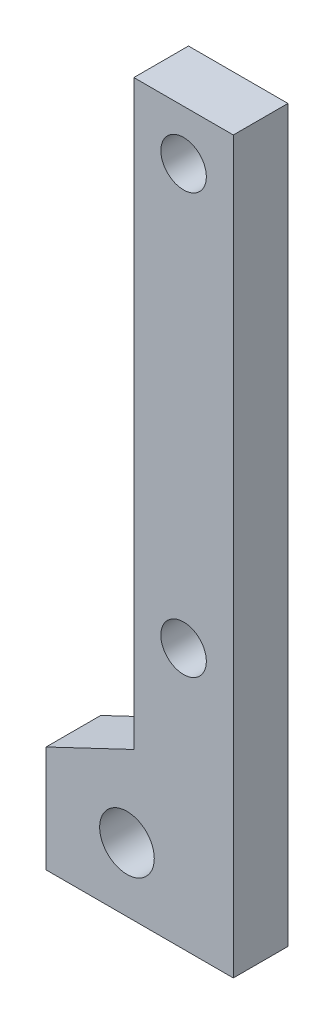
ISO-10303-21;
HEADER;
FILE_DESCRIPTION(('STEP AP214'),'2;1');
FILE_NAME('part.step','',(''),(''),'','','');
FILE_SCHEMA(('AUTOMOTIVE_DESIGN { 1 0 10303 214 1 1 1 1 }'));
ENDSEC;
DATA;
#1=APPLICATION_CONTEXT('core data for automotive mechanical design processes');
#2=APPLICATION_PROTOCOL_DEFINITION('international standard','automotive_design',2000,#1);
#3=PRODUCT_CONTEXT('',#1,'mechanical');
#4=PRODUCT('Part','Part','',(#3));
#5=PRODUCT_RELATED_PRODUCT_CATEGORY('part','',(#4));
#6=PRODUCT_DEFINITION_FORMATION('','',#4);
#7=PRODUCT_DEFINITION_CONTEXT('part definition',#1,'design');
#8=PRODUCT_DEFINITION('design','',#6,#7);
#9=PRODUCT_DEFINITION_SHAPE('','',#8);
#10=(LENGTH_UNIT() NAMED_UNIT(*) SI_UNIT(.MILLI.,.METRE.));
#11=(NAMED_UNIT(*) PLANE_ANGLE_UNIT() SI_UNIT($,.RADIAN.));
#12=(NAMED_UNIT(*) SI_UNIT($,.STERADIAN.) SOLID_ANGLE_UNIT());
#13=UNCERTAINTY_MEASURE_WITH_UNIT(LENGTH_MEASURE(1.E-05),#10,'distance_accuracy_value','');
#14=(GEOMETRIC_REPRESENTATION_CONTEXT(3) GLOBAL_UNCERTAINTY_ASSIGNED_CONTEXT((#13)) GLOBAL_UNIT_ASSIGNED_CONTEXT((#10,
#11,#12)) REPRESENTATION_CONTEXT('',''));
#15=CARTESIAN_POINT('',(0.,0.,0.));
#16=DIRECTION('',(0.,0.,1.));
#17=DIRECTION('',(1.,0.,0.));
#18=AXIS2_PLACEMENT_3D('',#15,#16,#17);
#19=CARTESIAN_POINT('',(0.,0.,3.));
#20=DIRECTION('',(0.,0.,-1.));
#21=DIRECTION('',(-1.,0.,0.));
#22=AXIS2_PLACEMENT_3D('',#19,#20,#21);
#23=PLANE('',#22);
#24=DIRECTION('',(0.,-1.,0.));
#25=VECTOR('',#24,1.);
#26=CARTESIAN_POINT('',(-31.4016504294496,13.9016504294496,3.));
#27=LINE('',#26,#25);
#28=CARTESIAN_POINT('',(-31.4016504294496,13.9016504294496,3.));
#29=VERTEX_POINT('',#28);
#30=CARTESIAN_POINT('',(-31.4016504294496,-18.062129593711,3.));
#31=VERTEX_POINT('',#30);
#32=EDGE_CURVE('E133',#29,#31,#27,.T.);
#33=ORIENTED_EDGE('',*,*,#32,.T.);
#34=DIRECTION('',(-0.90314324281955,-0.429339356394668,0.));
#35=VECTOR('',#34,1.);
#36=CARTESIAN_POINT('',(-36.2238095787433,-20.3545042774067,3.));
#37=LINE('',#36,#35);
#38=CARTESIAN_POINT('',(-36.2238095787433,-20.3545042774067,3.));
#39=VERTEX_POINT('',#38);
#40=EDGE_CURVE('E91',#31,#39,#37,.T.);
#41=ORIENTED_EDGE('',*,*,#40,.T.);
#42=DIRECTION('',(0.,-1.,0.));
#43=VECTOR('',#42,1.);
#44=CARTESIAN_POINT('',(-36.2238095787433,-26.2016384236574,3.));
#45=LINE('',#44,#43);
#46=CARTESIAN_POINT('',(-36.2238095787433,-26.2016384236574,3.));
#47=VERTEX_POINT('',#46);
#48=EDGE_CURVE('E104',#39,#47,#45,.T.);
#49=ORIENTED_EDGE('',*,*,#48,.T.);
#50=DIRECTION('',(1.,0.,0.));
#51=VECTOR('',#50,1.);
#52=CARTESIAN_POINT('',(-31.4016504294496,-26.2016384236574,3.));
#53=LINE('',#52,#51);
#54=CARTESIAN_POINT('',(-25.9384904067588,-26.2016384236574,3.));
#55=VERTEX_POINT('',#54);
#56=EDGE_CURVE('E98',#47,#55,#53,.T.);
#57=ORIENTED_EDGE('',*,*,#56,.T.);
#58=DIRECTION('',(0.,1.,0.));
#59=VECTOR('',#58,1.);
#60=CARTESIAN_POINT('',(-25.9384904067588,13.9016504294496,3.));
#61=LINE('',#60,#59);
#62=CARTESIAN_POINT('',(-25.9384904067588,13.9016504294496,3.));
#63=VERTEX_POINT('',#62);
#64=EDGE_CURVE('E102',#55,#63,#61,.T.);
#65=ORIENTED_EDGE('',*,*,#64,.T.);
#66=DIRECTION('',(-1.,0.,0.));
#67=VECTOR('',#66,1.);
#68=CARTESIAN_POINT('',(-31.4016504294496,13.9016504294496,3.));
#69=LINE('',#68,#67);
#70=EDGE_CURVE('E54',#63,#29,#69,.T.);
#71=ORIENTED_EDGE('',*,*,#70,.T.);
#72=EDGE_LOOP('',(#33,#41,#49,#57,#65,#71));
#73=FACE_BOUND('',#72,.T.);
#74=CARTESIAN_POINT('',(-28.6700704181042,11.1700704181042,3.));
#75=DIRECTION('',(0.,0.,1.));
#76=DIRECTION('',(1.,0.,0.));
#77=AXIS2_PLACEMENT_3D('',#74,#75,#76);
#78=CIRCLE('',#77,1.25);
#79=CARTESIAN_POINT('',(-27.4200704181042,11.1700704181042,3.));
#80=VERTEX_POINT('',#79);
#81=EDGE_CURVE('E125',#80,#80,#78,.T.);
#82=ORIENTED_EDGE('',*,*,#81,.F.);
#83=EDGE_LOOP('',(#82));
#84=FACE_BOUND('',#83,.T.);
#85=CARTESIAN_POINT('',(-28.6700704181042,-11.8799295818958,3.));
#86=DIRECTION('',(0.,0.,1.));
#87=DIRECTION('',(1.,0.,0.));
#88=AXIS2_PLACEMENT_3D('',#85,#86,#87);
#89=CIRCLE('',#88,1.25);
#90=CARTESIAN_POINT('',(-27.4200704181042,-11.8799295818958,3.));
#91=VERTEX_POINT('',#90);
#92=EDGE_CURVE('E187',#91,#91,#89,.T.);
#93=ORIENTED_EDGE('',*,*,#92,.F.);
#94=EDGE_LOOP('',(#93));
#95=FACE_BOUND('',#94,.T.);
#96=CARTESIAN_POINT('',(-31.7799939591758,-22.6938936404792,3.));
#97=DIRECTION('',(0.,0.,1.));
#98=DIRECTION('',(1.,0.,0.));
#99=AXIS2_PLACEMENT_3D('',#96,#97,#98);
#100=CIRCLE('',#99,1.5);
#101=CARTESIAN_POINT('',(-30.2799939591758,-22.6938936404792,3.));
#102=VERTEX_POINT('',#101);
#103=EDGE_CURVE('E178',#102,#102,#100,.T.);
#104=ORIENTED_EDGE('',*,*,#103,.F.);
#105=EDGE_LOOP('',(#104));
#106=FACE_BOUND('',#105,.T.);
#107=ADVANCED_FACE('F37',(#73,#84,#95,#106),#23,.F.);
#108=CARTESIAN_POINT('',(0.,0.,0.));
#109=DIRECTION('',(0.,0.,-1.));
#110=DIRECTION('',(-1.,0.,0.));
#111=AXIS2_PLACEMENT_3D('',#108,#109,#110);
#112=PLANE('',#111);
#113=CARTESIAN_POINT('',(-28.6700704181042,-11.8799295818958,0.));
#114=DIRECTION('',(0.,0.,1.));
#115=DIRECTION('',(1.,0.,0.));
#116=AXIS2_PLACEMENT_3D('',#113,#114,#115);
#117=CIRCLE('',#116,1.25);
#118=CARTESIAN_POINT('',(-27.4200704181042,-11.8799295818958,0.));
#119=VERTEX_POINT('',#118);
#120=EDGE_CURVE('E184',#119,#119,#117,.T.);
#121=ORIENTED_EDGE('',*,*,#120,.T.);
#122=EDGE_LOOP('',(#121));
#123=FACE_BOUND('',#122,.T.);
#124=DIRECTION('',(0.,-1.,0.));
#125=VECTOR('',#124,1.);
#126=CARTESIAN_POINT('',(-31.4016504294496,13.9016504294496,0.));
#127=LINE('',#126,#125);
#128=CARTESIAN_POINT('',(-31.4016504294496,13.9016504294496,0.));
#129=VERTEX_POINT('',#128);
#130=CARTESIAN_POINT('',(-31.4016504294496,-18.062129593711,0.));
#131=VERTEX_POINT('',#130);
#132=EDGE_CURVE('E121',#129,#131,#127,.T.);
#133=ORIENTED_EDGE('',*,*,#132,.F.);
#134=DIRECTION('',(-1.,0.,0.));
#135=VECTOR('',#134,1.);
#136=CARTESIAN_POINT('',(-31.4016504294496,13.9016504294496,0.));
#137=LINE('',#136,#135);
#138=CARTESIAN_POINT('',(-25.9384904067588,13.9016504294496,0.));
#139=VERTEX_POINT('',#138);
#140=EDGE_CURVE('E83',#139,#129,#137,.T.);
#141=ORIENTED_EDGE('',*,*,#140,.F.);
#142=DIRECTION('',(0.,1.,0.));
#143=VECTOR('',#142,1.);
#144=CARTESIAN_POINT('',(-25.9384904067588,13.9016504294496,0.));
#145=LINE('',#144,#143);
#146=CARTESIAN_POINT('',(-25.9384904067588,-26.2016384236574,0.));
#147=VERTEX_POINT('',#146);
#148=EDGE_CURVE('E77',#147,#139,#145,.T.);
#149=ORIENTED_EDGE('',*,*,#148,.F.);
#150=DIRECTION('',(1.,0.,0.));
#151=VECTOR('',#150,1.);
#152=CARTESIAN_POINT('',(-31.4016504294496,-26.2016384236574,0.));
#153=LINE('',#152,#151);
#154=CARTESIAN_POINT('',(-36.2238095787433,-26.2016384236574,0.));
#155=VERTEX_POINT('',#154);
#156=EDGE_CURVE('E111',#155,#147,#153,.T.);
#157=ORIENTED_EDGE('',*,*,#156,.F.);
#158=DIRECTION('',(0.,-1.,0.));
#159=VECTOR('',#158,1.);
#160=CARTESIAN_POINT('',(-36.2238095787433,-26.2016384236574,0.));
#161=LINE('',#160,#159);
#162=CARTESIAN_POINT('',(-36.2238095787433,-20.3545042774067,0.));
#163=VERTEX_POINT('',#162);
#164=EDGE_CURVE('E127',#163,#155,#161,.T.);
#165=ORIENTED_EDGE('',*,*,#164,.F.);
#166=DIRECTION('',(-0.90314324281955,-0.429339356394668,0.));
#167=VECTOR('',#166,1.);
#168=CARTESIAN_POINT('',(-36.2238095787433,-20.3545042774067,0.));
#169=LINE('',#168,#167);
#170=EDGE_CURVE('E124',#131,#163,#169,.T.);
#171=ORIENTED_EDGE('',*,*,#170,.F.);
#172=EDGE_LOOP('',(#133,#141,#149,#157,#165,#171));
#173=FACE_BOUND('',#172,.T.);
#174=CARTESIAN_POINT('',(-28.6700704181042,11.1700704181042,0.));
#175=DIRECTION('',(0.,0.,1.));
#176=DIRECTION('',(1.,0.,0.));
#177=AXIS2_PLACEMENT_3D('',#174,#175,#176);
#178=CIRCLE('',#177,1.25);
#179=CARTESIAN_POINT('',(-27.4200704181042,11.1700704181042,0.));
#180=VERTEX_POINT('',#179);
#181=EDGE_CURVE('E190',#180,#180,#178,.T.);
#182=ORIENTED_EDGE('',*,*,#181,.T.);
#183=EDGE_LOOP('',(#182));
#184=FACE_BOUND('',#183,.T.);
#185=CARTESIAN_POINT('',(-31.7799939591758,-22.6938936404792,0.));
#186=DIRECTION('',(0.,0.,1.));
#187=DIRECTION('',(1.,0.,0.));
#188=AXIS2_PLACEMENT_3D('',#185,#186,#187);
#189=CIRCLE('',#188,1.5);
#190=CARTESIAN_POINT('',(-30.2799939591758,-22.6938936404792,0.));
#191=VERTEX_POINT('',#190);
#192=EDGE_CURVE('E181',#191,#191,#189,.T.);
#193=ORIENTED_EDGE('',*,*,#192,.T.);
#194=EDGE_LOOP('',(#193));
#195=FACE_BOUND('',#194,.T.);
#196=ADVANCED_FACE('F142',(#123,#173,#184,#195),#112,.T.);
#197=CARTESIAN_POINT('',(-31.4016504294496,13.9016504294496,3.));
#198=DIRECTION('',(1.,0.,0.));
#199=DIRECTION('',(0.,0.,-1.));
#200=AXIS2_PLACEMENT_3D('',#197,#198,#199);
#201=PLANE('',#200);
#202=ORIENTED_EDGE('',*,*,#132,.T.);
#203=DIRECTION('',(0.,0.,-1.));
#204=VECTOR('',#203,1.);
#205=CARTESIAN_POINT('',(-31.4016504294496,-18.062129593711,3.));
#206=LINE('',#205,#204);
#207=EDGE_CURVE('E11',#31,#131,#206,.T.);
#208=ORIENTED_EDGE('',*,*,#207,.F.);
#209=ORIENTED_EDGE('',*,*,#32,.F.);
#210=DIRECTION('',(0.,0.,-1.));
#211=VECTOR('',#210,1.);
#212=CARTESIAN_POINT('',(-31.4016504294496,13.9016504294496,3.));
#213=LINE('',#212,#211);
#214=EDGE_CURVE('E117',#29,#129,#213,.T.);
#215=ORIENTED_EDGE('',*,*,#214,.T.);
#216=EDGE_LOOP('',(#202,#208,#209,#215));
#217=FACE_BOUND('',#216,.T.);
#218=ADVANCED_FACE('F39',(#217),#201,.F.);
#219=CARTESIAN_POINT('',(-36.2238095787433,-20.3545042774067,3.));
#220=DIRECTION('',(0.429339356394668,-0.90314324281955,0.));
#221=DIRECTION('',(0.90314324281955,0.429339356394668,0.));
#222=AXIS2_PLACEMENT_3D('',#219,#220,#221);
#223=PLANE('',#222);
#224=ORIENTED_EDGE('',*,*,#170,.T.);
#225=DIRECTION('',(0.,0.,-1.));
#226=VECTOR('',#225,1.);
#227=CARTESIAN_POINT('',(-36.2238095787433,-20.3545042774067,3.));
#228=LINE('',#227,#226);
#229=EDGE_CURVE('E46',#39,#163,#228,.T.);
#230=ORIENTED_EDGE('',*,*,#229,.F.);
#231=ORIENTED_EDGE('',*,*,#40,.F.);
#232=ORIENTED_EDGE('',*,*,#207,.T.);
#233=EDGE_LOOP('',(#224,#230,#231,#232));
#234=FACE_BOUND('',#233,.T.);
#235=ADVANCED_FACE('F242',(#234),#223,.F.);
#236=CARTESIAN_POINT('',(-36.2238095787433,-26.2016384236574,3.));
#237=DIRECTION('',(1.,0.,0.));
#238=DIRECTION('',(0.,0.,-1.));
#239=AXIS2_PLACEMENT_3D('',#236,#237,#238);
#240=PLANE('',#239);
#241=ORIENTED_EDGE('',*,*,#164,.T.);
#242=DIRECTION('',(0.,0.,-1.));
#243=VECTOR('',#242,1.);
#244=CARTESIAN_POINT('',(-36.2238095787433,-26.2016384236574,3.));
#245=LINE('',#244,#243);
#246=EDGE_CURVE('E112',#47,#155,#245,.T.);
#247=ORIENTED_EDGE('',*,*,#246,.F.);
#248=ORIENTED_EDGE('',*,*,#48,.F.);
#249=ORIENTED_EDGE('',*,*,#229,.T.);
#250=EDGE_LOOP('',(#241,#247,#248,#249));
#251=FACE_BOUND('',#250,.T.);
#252=ADVANCED_FACE('F139',(#251),#240,.F.);
#253=CARTESIAN_POINT('',(-31.4016504294496,-26.2016384236574,3.));
#254=DIRECTION('',(0.,1.,0.));
#255=DIRECTION('',(0.,0.,1.));
#256=AXIS2_PLACEMENT_3D('',#253,#254,#255);
#257=PLANE('',#256);
#258=ORIENTED_EDGE('',*,*,#156,.T.);
#259=DIRECTION('',(0.,0.,-1.));
#260=VECTOR('',#259,1.);
#261=CARTESIAN_POINT('',(-25.9384904067588,-26.2016384236574,3.));
#262=LINE('',#261,#260);
#263=EDGE_CURVE('E109',#55,#147,#262,.T.);
#264=ORIENTED_EDGE('',*,*,#263,.F.);
#265=ORIENTED_EDGE('',*,*,#56,.F.);
#266=ORIENTED_EDGE('',*,*,#246,.T.);
#267=EDGE_LOOP('',(#258,#264,#265,#266));
#268=FACE_BOUND('',#267,.T.);
#269=ADVANCED_FACE('F110',(#268),#257,.F.);
#270=CARTESIAN_POINT('',(-25.9384904067588,13.9016504294496,3.));
#271=DIRECTION('',(-1.,0.,0.));
#272=DIRECTION('',(0.,-1.,0.));
#273=AXIS2_PLACEMENT_3D('',#270,#271,#272);
#274=PLANE('',#273);
#275=ORIENTED_EDGE('',*,*,#148,.T.);
#276=DIRECTION('',(0.,0.,-1.));
#277=VECTOR('',#276,1.);
#278=CARTESIAN_POINT('',(-25.9384904067588,13.9016504294496,3.));
#279=LINE('',#278,#277);
#280=EDGE_CURVE('E113',#63,#139,#279,.T.);
#281=ORIENTED_EDGE('',*,*,#280,.F.);
#282=ORIENTED_EDGE('',*,*,#64,.F.);
#283=ORIENTED_EDGE('',*,*,#263,.T.);
#284=EDGE_LOOP('',(#275,#281,#282,#283));
#285=FACE_BOUND('',#284,.T.);
#286=ADVANCED_FACE('F115',(#285),#274,.F.);
#287=CARTESIAN_POINT('',(-31.4016504294496,13.9016504294496,3.));
#288=DIRECTION('',(0.,-1.,0.));
#289=DIRECTION('',(0.,0.,-1.));
#290=AXIS2_PLACEMENT_3D('',#287,#288,#289);
#291=PLANE('',#290);
#292=ORIENTED_EDGE('',*,*,#140,.T.);
#293=ORIENTED_EDGE('',*,*,#214,.F.);
#294=ORIENTED_EDGE('',*,*,#70,.F.);
#295=ORIENTED_EDGE('',*,*,#280,.T.);
#296=EDGE_LOOP('',(#292,#293,#294,#295));
#297=FACE_BOUND('',#296,.T.);
#298=ADVANCED_FACE('F147',(#297),#291,.F.);
#299=CARTESIAN_POINT('',(-28.6700704181042,11.1700704181042,3.));
#300=DIRECTION('',(0.,0.,-1.));
#301=DIRECTION('',(-1.,0.,0.));
#302=AXIS2_PLACEMENT_3D('',#299,#300,#301);
#303=CYLINDRICAL_SURFACE('',#302,1.25);
#304=ORIENTED_EDGE('',*,*,#81,.T.);
#305=EDGE_LOOP('',(#304));
#306=FACE_BOUND('',#305,.T.);
#307=ORIENTED_EDGE('',*,*,#181,.F.);
#308=EDGE_LOOP('',(#307));
#309=FACE_BOUND('',#308,.T.);
#310=ADVANCED_FACE('F149',(#306,#309),#303,.F.);
#311=CARTESIAN_POINT('',(-28.6700704181042,-11.8799295818958,3.));
#312=DIRECTION('',(0.,0.,-1.));
#313=DIRECTION('',(-1.,0.,0.));
#314=AXIS2_PLACEMENT_3D('',#311,#312,#313);
#315=CYLINDRICAL_SURFACE('',#314,1.25);
#316=ORIENTED_EDGE('',*,*,#92,.T.);
#317=EDGE_LOOP('',(#316));
#318=FACE_BOUND('',#317,.T.);
#319=ORIENTED_EDGE('',*,*,#120,.F.);
#320=EDGE_LOOP('',(#319));
#321=FACE_BOUND('',#320,.T.);
#322=ADVANCED_FACE('F155',(#318,#321),#315,.F.);
#323=CARTESIAN_POINT('',(-31.7799939591758,-22.6938936404792,3.));
#324=DIRECTION('',(0.,0.,-1.));
#325=DIRECTION('',(-1.,0.,0.));
#326=AXIS2_PLACEMENT_3D('',#323,#324,#325);
#327=CYLINDRICAL_SURFACE('',#326,1.5);
#328=ORIENTED_EDGE('',*,*,#103,.T.);
#329=EDGE_LOOP('',(#328));
#330=FACE_BOUND('',#329,.T.);
#331=ORIENTED_EDGE('',*,*,#192,.F.);
#332=EDGE_LOOP('',(#331));
#333=FACE_BOUND('',#332,.T.);
#334=ADVANCED_FACE('F169',(#330,#333),#327,.F.);
#335=CLOSED_SHELL('',(#107,#196,#218,#235,#252,#269,#286,#298,#310,#322,#334));
#336=MANIFOLD_SOLID_BREP('B2',#335);
#337=ADVANCED_BREP_SHAPE_REPRESENTATION('',(#18,#336),#14);
#338=SHAPE_DEFINITION_REPRESENTATION(#9,#337);
ENDSEC;
END-ISO-10303-21;
